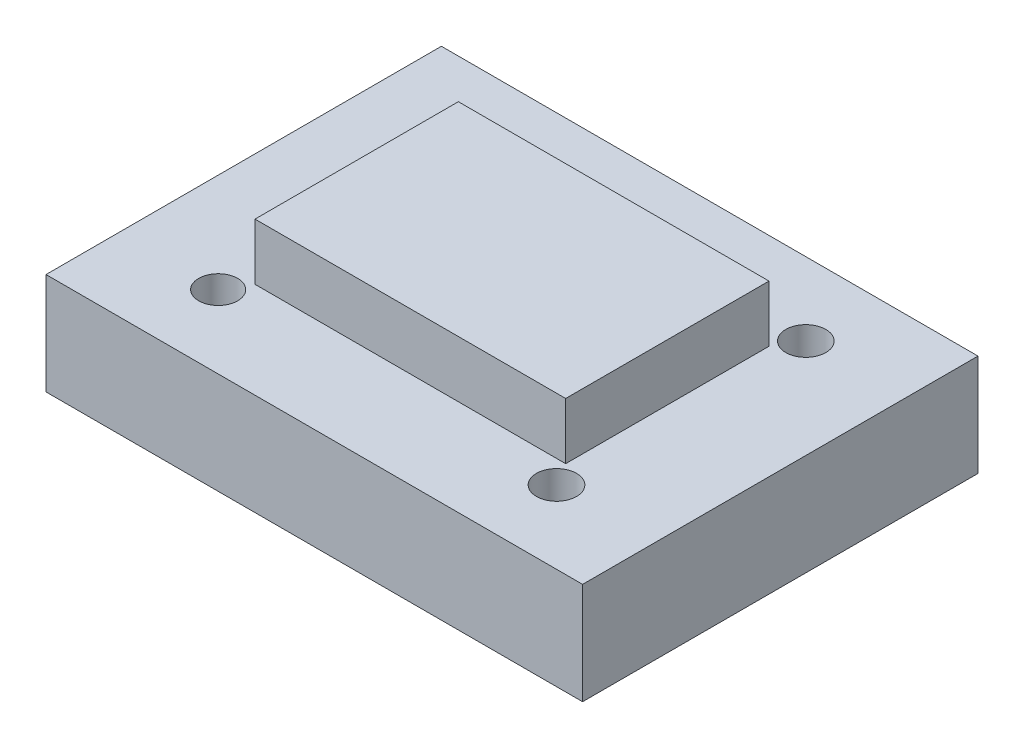
ISO-10303-21;
HEADER;
FILE_DESCRIPTION(('STEP AP214'),'2;1');
FILE_NAME('part.step','',(''),(''),'','','');
FILE_SCHEMA(('AUTOMOTIVE_DESIGN { 1 0 10303 214 1 1 1 1 }'));
ENDSEC;
DATA;
#1=APPLICATION_CONTEXT('core data for automotive mechanical design processes');
#2=APPLICATION_PROTOCOL_DEFINITION('international standard','automotive_design',2000,#1);
#3=PRODUCT_CONTEXT('',#1,'mechanical');
#4=PRODUCT('Part','Part','',(#3));
#5=PRODUCT_RELATED_PRODUCT_CATEGORY('part','',(#4));
#6=PRODUCT_DEFINITION_FORMATION('','',#4);
#7=PRODUCT_DEFINITION_CONTEXT('part definition',#1,'design');
#8=PRODUCT_DEFINITION('design','',#6,#7);
#9=PRODUCT_DEFINITION_SHAPE('','',#8);
#10=(LENGTH_UNIT() NAMED_UNIT(*) SI_UNIT(.MILLI.,.METRE.));
#11=(NAMED_UNIT(*) PLANE_ANGLE_UNIT() SI_UNIT($,.RADIAN.));
#12=(NAMED_UNIT(*) SI_UNIT($,.STERADIAN.) SOLID_ANGLE_UNIT());
#13=UNCERTAINTY_MEASURE_WITH_UNIT(LENGTH_MEASURE(1.E-05),#10,'distance_accuracy_value','');
#14=(GEOMETRIC_REPRESENTATION_CONTEXT(3) GLOBAL_UNCERTAINTY_ASSIGNED_CONTEXT((#13)) GLOBAL_UNIT_ASSIGNED_CONTEXT((#10,
#11,#12)) REPRESENTATION_CONTEXT('',''));
#15=CARTESIAN_POINT('',(0.,0.,0.));
#16=DIRECTION('',(0.,0.,1.));
#17=DIRECTION('',(1.,0.,0.));
#18=AXIS2_PLACEMENT_3D('',#15,#16,#17);
#19=CARTESIAN_POINT('',(0.,18.,0.));
#20=DIRECTION('',(0.,-1.,0.));
#21=DIRECTION('',(0.,0.,-1.));
#22=AXIS2_PLACEMENT_3D('',#19,#20,#21);
#23=PLANE('',#22);
#24=DIRECTION('',(0.,0.,-1.));
#25=VECTOR('',#24,1.);
#26=CARTESIAN_POINT('',(47.5,18.,35.));
#27=LINE('',#26,#25);
#28=CARTESIAN_POINT('',(47.5,18.,35.));
#29=VERTEX_POINT('',#28);
#30=CARTESIAN_POINT('',(47.5,18.,-35.));
#31=VERTEX_POINT('',#30);
#32=EDGE_CURVE('E160',#29,#31,#27,.T.);
#33=ORIENTED_EDGE('',*,*,#32,.T.);
#34=DIRECTION('',(-1.,0.,0.));
#35=VECTOR('',#34,1.);
#36=CARTESIAN_POINT('',(-47.5,18.,-35.));
#37=LINE('',#36,#35);
#38=CARTESIAN_POINT('',(-47.5,18.,-35.));
#39=VERTEX_POINT('',#38);
#40=EDGE_CURVE('E163',#31,#39,#37,.T.);
#41=ORIENTED_EDGE('',*,*,#40,.T.);
#42=DIRECTION('',(0.,0.,1.));
#43=VECTOR('',#42,1.);
#44=CARTESIAN_POINT('',(-47.5,18.,35.));
#45=LINE('',#44,#43);
#46=CARTESIAN_POINT('',(-47.5,18.,35.));
#47=VERTEX_POINT('',#46);
#48=EDGE_CURVE('E166',#39,#47,#45,.T.);
#49=ORIENTED_EDGE('',*,*,#48,.T.);
#50=DIRECTION('',(1.,0.,0.));
#51=VECTOR('',#50,1.);
#52=CARTESIAN_POINT('',(-47.5,18.,35.));
#53=LINE('',#52,#51);
#54=EDGE_CURVE('E168',#47,#29,#53,.T.);
#55=ORIENTED_EDGE('',*,*,#54,.T.);
#56=EDGE_LOOP('',(#33,#41,#49,#55));
#57=FACE_BOUND('',#56,.T.);
#58=CARTESIAN_POINT('',(-29.9497307001795,18.,22.0682226211849));
#59=DIRECTION('',(0.,1.,0.));
#60=DIRECTION('',(0.,0.,1.));
#61=AXIS2_PLACEMENT_3D('',#58,#59,#60);
#62=CIRCLE('',#61,3.45040522689763);
#63=CARTESIAN_POINT('',(-29.9497307001795,18.,25.5186278480825));
#64=VERTEX_POINT('',#63);
#65=EDGE_CURVE('E154',#64,#64,#62,.T.);
#66=ORIENTED_EDGE('',*,*,#65,.F.);
#67=EDGE_LOOP('',(#66));
#68=FACE_BOUND('',#67,.T.);
#69=CARTESIAN_POINT('',(29.9497307001796,18.,22.0682226211849));
#70=DIRECTION('',(0.,1.,0.));
#71=DIRECTION('',(0.,0.,1.));
#72=AXIS2_PLACEMENT_3D('',#69,#70,#71);
#73=CIRCLE('',#72,3.55026929982041);
#74=CARTESIAN_POINT('',(29.9497307001796,18.,25.6184919210054));
#75=VERTEX_POINT('',#74);
#76=EDGE_CURVE('E148',#75,#75,#73,.T.);
#77=ORIENTED_EDGE('',*,*,#76,.F.);
#78=EDGE_LOOP('',(#77));
#79=FACE_BOUND('',#78,.T.);
#80=CARTESIAN_POINT('',(-29.9497307001795,18.,-22.0682226211849));
#81=DIRECTION('',(0.,1.,0.));
#82=DIRECTION('',(0.,0.,1.));
#83=AXIS2_PLACEMENT_3D('',#80,#81,#82);
#84=CIRCLE('',#83,3.45040522689762);
#85=CARTESIAN_POINT('',(-29.9497307001795,18.,-18.6178173942873));
#86=VERTEX_POINT('',#85);
#87=EDGE_CURVE('E142',#86,#86,#84,.T.);
#88=ORIENTED_EDGE('',*,*,#87,.F.);
#89=EDGE_LOOP('',(#88));
#90=FACE_BOUND('',#89,.T.);
#91=CARTESIAN_POINT('',(29.9497307001796,18.,-22.068222621185));
#92=DIRECTION('',(0.,1.,0.));
#93=DIRECTION('',(0.,0.,1.));
#94=AXIS2_PLACEMENT_3D('',#91,#92,#93);
#95=CIRCLE('',#94,3.5502692998204);
#96=CARTESIAN_POINT('',(29.9497307001796,18.,-18.5179533213646));
#97=VERTEX_POINT('',#96);
#98=EDGE_CURVE('E136',#97,#97,#95,.T.);
#99=ORIENTED_EDGE('',*,*,#98,.F.);
#100=EDGE_LOOP('',(#99));
#101=FACE_BOUND('',#100,.T.);
#102=DIRECTION('',(0.,0.,-1.));
#103=VECTOR('',#102,1.);
#104=CARTESIAN_POINT('',(27.5,18.,0.));
#105=LINE('',#104,#103);
#106=CARTESIAN_POINT('',(27.5,18.,18.));
#107=VERTEX_POINT('',#106);
#108=CARTESIAN_POINT('',(27.5,18.,-18.));
#109=VERTEX_POINT('',#108);
#110=EDGE_CURVE('E123',#107,#109,#105,.T.);
#111=ORIENTED_EDGE('',*,*,#110,.F.);
#112=DIRECTION('',(1.,0.,0.));
#113=VECTOR('',#112,1.);
#114=CARTESIAN_POINT('',(0.,18.,18.));
#115=LINE('',#114,#113);
#116=CARTESIAN_POINT('',(-27.5,18.,18.));
#117=VERTEX_POINT('',#116);
#118=EDGE_CURVE('E124',#117,#107,#115,.T.);
#119=ORIENTED_EDGE('',*,*,#118,.F.);
#120=DIRECTION('',(0.,0.,1.));
#121=VECTOR('',#120,1.);
#122=CARTESIAN_POINT('',(-27.5,18.,0.));
#123=LINE('',#122,#121);
#124=CARTESIAN_POINT('',(-27.5,18.,-18.));
#125=VERTEX_POINT('',#124);
#126=EDGE_CURVE('E59',#125,#117,#123,.T.);
#127=ORIENTED_EDGE('',*,*,#126,.F.);
#128=DIRECTION('',(-1.,0.,0.));
#129=VECTOR('',#128,1.);
#130=CARTESIAN_POINT('',(0.,18.,-18.));
#131=LINE('',#130,#129);
#132=EDGE_CURVE('E54',#109,#125,#131,.T.);
#133=ORIENTED_EDGE('',*,*,#132,.F.);
#134=EDGE_LOOP('',(#111,#119,#127,#133));
#135=FACE_BOUND('',#134,.T.);
#136=ADVANCED_FACE('F39',(#57,#68,#79,#90,#101,#135),#23,.F.);
#137=CARTESIAN_POINT('',(0.,0.,0.));
#138=DIRECTION('',(0.,-1.,0.));
#139=DIRECTION('',(0.,0.,-1.));
#140=AXIS2_PLACEMENT_3D('',#137,#138,#139);
#141=PLANE('',#140);
#142=CARTESIAN_POINT('',(29.9497307001796,0.,-22.068222621185));
#143=DIRECTION('',(0.,1.,0.));
#144=DIRECTION('',(0.,0.,1.));
#145=AXIS2_PLACEMENT_3D('',#142,#143,#144);
#146=CIRCLE('',#145,3.5502692998204);
#147=CARTESIAN_POINT('',(29.9497307001796,0.,-18.5179533213646));
#148=VERTEX_POINT('',#147);
#149=EDGE_CURVE('E135',#148,#148,#146,.T.);
#150=ORIENTED_EDGE('',*,*,#149,.T.);
#151=EDGE_LOOP('',(#150));
#152=FACE_BOUND('',#151,.T.);
#153=CARTESIAN_POINT('',(29.9497307001796,0.,22.0682226211849));
#154=DIRECTION('',(0.,1.,0.));
#155=DIRECTION('',(0.,0.,1.));
#156=AXIS2_PLACEMENT_3D('',#153,#154,#155);
#157=CIRCLE('',#156,3.55026929982041);
#158=CARTESIAN_POINT('',(29.9497307001796,0.,25.6184919210054));
#159=VERTEX_POINT('',#158);
#160=EDGE_CURVE('E145',#159,#159,#157,.T.);
#161=ORIENTED_EDGE('',*,*,#160,.T.);
#162=EDGE_LOOP('',(#161));
#163=FACE_BOUND('',#162,.T.);
#164=DIRECTION('',(0.,0.,-1.));
#165=VECTOR('',#164,1.);
#166=CARTESIAN_POINT('',(47.5,0.,35.));
#167=LINE('',#166,#165);
#168=CARTESIAN_POINT('',(47.5,0.,35.));
#169=VERTEX_POINT('',#168);
#170=CARTESIAN_POINT('',(47.5,0.,-35.));
#171=VERTEX_POINT('',#170);
#172=EDGE_CURVE('E157',#169,#171,#167,.T.);
#173=ORIENTED_EDGE('',*,*,#172,.F.);
#174=DIRECTION('',(1.,0.,0.));
#175=VECTOR('',#174,1.);
#176=CARTESIAN_POINT('',(-47.5,0.,35.));
#177=LINE('',#176,#175);
#178=CARTESIAN_POINT('',(-47.5,0.,35.));
#179=VERTEX_POINT('',#178);
#180=EDGE_CURVE('E164',#179,#169,#177,.T.);
#181=ORIENTED_EDGE('',*,*,#180,.F.);
#182=DIRECTION('',(0.,0.,1.));
#183=VECTOR('',#182,1.);
#184=CARTESIAN_POINT('',(-47.5,0.,35.));
#185=LINE('',#184,#183);
#186=CARTESIAN_POINT('',(-47.5,0.,-35.));
#187=VERTEX_POINT('',#186);
#188=EDGE_CURVE('E175',#187,#179,#185,.T.);
#189=ORIENTED_EDGE('',*,*,#188,.F.);
#190=DIRECTION('',(-1.,0.,0.));
#191=VECTOR('',#190,1.);
#192=CARTESIAN_POINT('',(-47.5,0.,-35.));
#193=LINE('',#192,#191);
#194=EDGE_CURVE('E173',#171,#187,#193,.T.);
#195=ORIENTED_EDGE('',*,*,#194,.F.);
#196=EDGE_LOOP('',(#173,#181,#189,#195));
#197=FACE_BOUND('',#196,.T.);
#198=CARTESIAN_POINT('',(-29.9497307001795,0.,22.0682226211849));
#199=DIRECTION('',(0.,1.,0.));
#200=DIRECTION('',(0.,0.,1.));
#201=AXIS2_PLACEMENT_3D('',#198,#199,#200);
#202=CIRCLE('',#201,3.45040522689763);
#203=CARTESIAN_POINT('',(-29.9497307001795,0.,25.5186278480825));
#204=VERTEX_POINT('',#203);
#205=EDGE_CURVE('E151',#204,#204,#202,.T.);
#206=ORIENTED_EDGE('',*,*,#205,.T.);
#207=EDGE_LOOP('',(#206));
#208=FACE_BOUND('',#207,.T.);
#209=CARTESIAN_POINT('',(-29.9497307001795,0.,-22.0682226211849));
#210=DIRECTION('',(0.,1.,0.));
#211=DIRECTION('',(0.,0.,1.));
#212=AXIS2_PLACEMENT_3D('',#209,#210,#211);
#213=CIRCLE('',#212,3.45040522689762);
#214=CARTESIAN_POINT('',(-29.9497307001795,0.,-18.6178173942873));
#215=VERTEX_POINT('',#214);
#216=EDGE_CURVE('E139',#215,#215,#213,.T.);
#217=ORIENTED_EDGE('',*,*,#216,.T.);
#218=EDGE_LOOP('',(#217));
#219=FACE_BOUND('',#218,.T.);
#220=ADVANCED_FACE('F193',(#152,#163,#197,#208,#219),#141,.T.);
#221=CARTESIAN_POINT('',(47.5,18.,35.));
#222=DIRECTION('',(-1.,0.,0.));
#223=DIRECTION('',(0.,0.,1.));
#224=AXIS2_PLACEMENT_3D('',#221,#222,#223);
#225=PLANE('',#224);
#226=ORIENTED_EDGE('',*,*,#172,.T.);
#227=DIRECTION('',(0.,-1.,0.));
#228=VECTOR('',#227,1.);
#229=CARTESIAN_POINT('',(47.5,18.,-35.));
#230=LINE('',#229,#228);
#231=EDGE_CURVE('E11',#31,#171,#230,.T.);
#232=ORIENTED_EDGE('',*,*,#231,.F.);
#233=ORIENTED_EDGE('',*,*,#32,.F.);
#234=DIRECTION('',(0.,-1.,0.));
#235=VECTOR('',#234,1.);
#236=CARTESIAN_POINT('',(47.5,18.,35.));
#237=LINE('',#236,#235);
#238=EDGE_CURVE('E170',#29,#169,#237,.T.);
#239=ORIENTED_EDGE('',*,*,#238,.T.);
#240=EDGE_LOOP('',(#226,#232,#233,#239));
#241=FACE_BOUND('',#240,.T.);
#242=ADVANCED_FACE('F41',(#241),#225,.F.);
#243=CARTESIAN_POINT('',(-47.5,18.,-35.));
#244=DIRECTION('',(0.,0.,1.));
#245=DIRECTION('',(1.,0.,0.));
#246=AXIS2_PLACEMENT_3D('',#243,#244,#245);
#247=PLANE('',#246);
#248=ORIENTED_EDGE('',*,*,#194,.T.);
#249=DIRECTION('',(0.,-1.,0.));
#250=VECTOR('',#249,1.);
#251=CARTESIAN_POINT('',(-47.5,18.,-35.));
#252=LINE('',#251,#250);
#253=EDGE_CURVE('E47',#39,#187,#252,.T.);
#254=ORIENTED_EDGE('',*,*,#253,.F.);
#255=ORIENTED_EDGE('',*,*,#40,.F.);
#256=ORIENTED_EDGE('',*,*,#231,.T.);
#257=EDGE_LOOP('',(#248,#254,#255,#256));
#258=FACE_BOUND('',#257,.T.);
#259=ADVANCED_FACE('F204',(#258),#247,.F.);
#260=CARTESIAN_POINT('',(-47.5,18.,35.));
#261=DIRECTION('',(1.,0.,0.));
#262=DIRECTION('',(0.,0.,-1.));
#263=AXIS2_PLACEMENT_3D('',#260,#261,#262);
#264=PLANE('',#263);
#265=ORIENTED_EDGE('',*,*,#188,.T.);
#266=DIRECTION('',(0.,-1.,0.));
#267=VECTOR('',#266,1.);
#268=CARTESIAN_POINT('',(-47.5,18.,35.));
#269=LINE('',#268,#267);
#270=EDGE_CURVE('E180',#47,#179,#269,.T.);
#271=ORIENTED_EDGE('',*,*,#270,.F.);
#272=ORIENTED_EDGE('',*,*,#48,.F.);
#273=ORIENTED_EDGE('',*,*,#253,.T.);
#274=EDGE_LOOP('',(#265,#271,#272,#273));
#275=FACE_BOUND('',#274,.T.);
#276=ADVANCED_FACE('F187',(#275),#264,.F.);
#277=CARTESIAN_POINT('',(-47.5,18.,35.));
#278=DIRECTION('',(0.,0.,-1.));
#279=DIRECTION('',(-1.,0.,0.));
#280=AXIS2_PLACEMENT_3D('',#277,#278,#279);
#281=PLANE('',#280);
#282=ORIENTED_EDGE('',*,*,#180,.T.);
#283=ORIENTED_EDGE('',*,*,#238,.F.);
#284=ORIENTED_EDGE('',*,*,#54,.F.);
#285=ORIENTED_EDGE('',*,*,#270,.T.);
#286=EDGE_LOOP('',(#282,#283,#284,#285));
#287=FACE_BOUND('',#286,.T.);
#288=ADVANCED_FACE('F197',(#287),#281,.F.);
#289=CARTESIAN_POINT('',(-29.9497307001795,18.,22.0682226211849));
#290=DIRECTION('',(0.,-1.,0.));
#291=DIRECTION('',(0.,0.,-1.));
#292=AXIS2_PLACEMENT_3D('',#289,#290,#291);
#293=CYLINDRICAL_SURFACE('',#292,3.45040522689763);
#294=ORIENTED_EDGE('',*,*,#65,.T.);
#295=EDGE_LOOP('',(#294));
#296=FACE_BOUND('',#295,.T.);
#297=ORIENTED_EDGE('',*,*,#205,.F.);
#298=EDGE_LOOP('',(#297));
#299=FACE_BOUND('',#298,.T.);
#300=ADVANCED_FACE('F219',(#296,#299),#293,.F.);
#301=CARTESIAN_POINT('',(29.9497307001796,18.,22.0682226211849));
#302=DIRECTION('',(0.,-1.,0.));
#303=DIRECTION('',(0.,0.,-1.));
#304=AXIS2_PLACEMENT_3D('',#301,#302,#303);
#305=CYLINDRICAL_SURFACE('',#304,3.55026929982041);
#306=ORIENTED_EDGE('',*,*,#76,.T.);
#307=EDGE_LOOP('',(#306));
#308=FACE_BOUND('',#307,.T.);
#309=ORIENTED_EDGE('',*,*,#160,.F.);
#310=EDGE_LOOP('',(#309));
#311=FACE_BOUND('',#310,.T.);
#312=ADVANCED_FACE('F226',(#308,#311),#305,.F.);
#313=CARTESIAN_POINT('',(-29.9497307001795,18.,-22.0682226211849));
#314=DIRECTION('',(0.,-1.,0.));
#315=DIRECTION('',(0.,0.,-1.));
#316=AXIS2_PLACEMENT_3D('',#313,#314,#315);
#317=CYLINDRICAL_SURFACE('',#316,3.45040522689762);
#318=ORIENTED_EDGE('',*,*,#87,.T.);
#319=EDGE_LOOP('',(#318));
#320=FACE_BOUND('',#319,.T.);
#321=ORIENTED_EDGE('',*,*,#216,.F.);
#322=EDGE_LOOP('',(#321));
#323=FACE_BOUND('',#322,.T.);
#324=ADVANCED_FACE('F231',(#320,#323),#317,.F.);
#325=CARTESIAN_POINT('',(29.9497307001796,18.,-22.068222621185));
#326=DIRECTION('',(0.,-1.,0.));
#327=DIRECTION('',(0.,0.,-1.));
#328=AXIS2_PLACEMENT_3D('',#325,#326,#327);
#329=CYLINDRICAL_SURFACE('',#328,3.5502692998204);
#330=ORIENTED_EDGE('',*,*,#98,.T.);
#331=EDGE_LOOP('',(#330));
#332=FACE_BOUND('',#331,.T.);
#333=ORIENTED_EDGE('',*,*,#149,.F.);
#334=EDGE_LOOP('',(#333));
#335=FACE_BOUND('',#334,.T.);
#336=ADVANCED_FACE('F240',(#332,#335),#329,.F.);
#337=CARTESIAN_POINT('',(27.5,28.,18.));
#338=DIRECTION('',(-1.,0.,0.));
#339=DIRECTION('',(0.,0.,1.));
#340=AXIS2_PLACEMENT_3D('',#337,#338,#339);
#341=PLANE('',#340);
#342=DIRECTION('',(0.,-1.,0.));
#343=VECTOR('',#342,1.);
#344=CARTESIAN_POINT('',(27.5,28.,18.));
#345=LINE('',#344,#343);
#346=CARTESIAN_POINT('',(27.5,28.,18.));
#347=VERTEX_POINT('',#346);
#348=EDGE_CURVE('E377',#347,#107,#345,.T.);
#349=ORIENTED_EDGE('',*,*,#348,.T.);
#350=ORIENTED_EDGE('',*,*,#110,.T.);
#351=DIRECTION('',(0.,-1.,0.));
#352=VECTOR('',#351,1.);
#353=CARTESIAN_POINT('',(27.5,28.,-18.));
#354=LINE('',#353,#352);
#355=CARTESIAN_POINT('',(27.5,28.,-18.));
#356=VERTEX_POINT('',#355);
#357=EDGE_CURVE('E106',#356,#109,#354,.T.);
#358=ORIENTED_EDGE('',*,*,#357,.F.);
#359=DIRECTION('',(0.,0.,-1.));
#360=VECTOR('',#359,1.);
#361=CARTESIAN_POINT('',(27.5,28.,18.));
#362=LINE('',#361,#360);
#363=EDGE_CURVE('E112',#347,#356,#362,.T.);
#364=ORIENTED_EDGE('',*,*,#363,.F.);
#365=EDGE_LOOP('',(#349,#350,#358,#364));
#366=FACE_BOUND('',#365,.T.);
#367=ADVANCED_FACE('F122',(#366),#341,.F.);
#368=CARTESIAN_POINT('',(-27.5,28.,-18.));
#369=DIRECTION('',(0.,0.,1.));
#370=DIRECTION('',(1.,0.,0.));
#371=AXIS2_PLACEMENT_3D('',#368,#369,#370);
#372=PLANE('',#371);
#373=ORIENTED_EDGE('',*,*,#357,.T.);
#374=ORIENTED_EDGE('',*,*,#132,.T.);
#375=DIRECTION('',(0.,-1.,0.));
#376=VECTOR('',#375,1.);
#377=CARTESIAN_POINT('',(-27.5,28.,-18.));
#378=LINE('',#377,#376);
#379=CARTESIAN_POINT('',(-27.5,28.,-18.));
#380=VERTEX_POINT('',#379);
#381=EDGE_CURVE('E108',#380,#125,#378,.T.);
#382=ORIENTED_EDGE('',*,*,#381,.F.);
#383=DIRECTION('',(-1.,0.,0.));
#384=VECTOR('',#383,1.);
#385=CARTESIAN_POINT('',(-27.5,28.,-18.));
#386=LINE('',#385,#384);
#387=EDGE_CURVE('E102',#356,#380,#386,.T.);
#388=ORIENTED_EDGE('',*,*,#387,.F.);
#389=EDGE_LOOP('',(#373,#374,#382,#388));
#390=FACE_BOUND('',#389,.T.);
#391=ADVANCED_FACE('F104',(#390),#372,.F.);
#392=CARTESIAN_POINT('',(-27.5,28.,18.));
#393=DIRECTION('',(1.,0.,0.));
#394=DIRECTION('',(0.,0.,-1.));
#395=AXIS2_PLACEMENT_3D('',#392,#393,#394);
#396=PLANE('',#395);
#397=ORIENTED_EDGE('',*,*,#381,.T.);
#398=ORIENTED_EDGE('',*,*,#126,.T.);
#399=DIRECTION('',(0.,-1.,0.));
#400=VECTOR('',#399,1.);
#401=CARTESIAN_POINT('',(-27.5,28.,18.));
#402=LINE('',#401,#400);
#403=CARTESIAN_POINT('',(-27.5,28.,18.));
#404=VERTEX_POINT('',#403);
#405=EDGE_CURVE('E128',#404,#117,#402,.T.);
#406=ORIENTED_EDGE('',*,*,#405,.F.);
#407=DIRECTION('',(0.,0.,1.));
#408=VECTOR('',#407,1.);
#409=CARTESIAN_POINT('',(-27.5,28.,18.));
#410=LINE('',#409,#408);
#411=EDGE_CURVE('E111',#380,#404,#410,.T.);
#412=ORIENTED_EDGE('',*,*,#411,.F.);
#413=EDGE_LOOP('',(#397,#398,#406,#412));
#414=FACE_BOUND('',#413,.T.);
#415=ADVANCED_FACE('F253',(#414),#396,.F.);
#416=CARTESIAN_POINT('',(-27.5,28.,18.));
#417=DIRECTION('',(0.,0.,-1.));
#418=DIRECTION('',(-1.,0.,0.));
#419=AXIS2_PLACEMENT_3D('',#416,#417,#418);
#420=PLANE('',#419);
#421=ORIENTED_EDGE('',*,*,#405,.T.);
#422=ORIENTED_EDGE('',*,*,#118,.T.);
#423=ORIENTED_EDGE('',*,*,#348,.F.);
#424=DIRECTION('',(1.,0.,0.));
#425=VECTOR('',#424,1.);
#426=CARTESIAN_POINT('',(-27.5,28.,18.));
#427=LINE('',#426,#425);
#428=EDGE_CURVE('E117',#404,#347,#427,.T.);
#429=ORIENTED_EDGE('',*,*,#428,.F.);
#430=EDGE_LOOP('',(#421,#422,#423,#429));
#431=FACE_BOUND('',#430,.T.);
#432=ADVANCED_FACE('F256',(#431),#420,.F.);
#433=CARTESIAN_POINT('',(0.,28.,0.));
#434=DIRECTION('',(0.,-1.,0.));
#435=DIRECTION('',(0.,0.,-1.));
#436=AXIS2_PLACEMENT_3D('',#433,#434,#435);
#437=PLANE('',#436);
#438=ORIENTED_EDGE('',*,*,#363,.T.);
#439=ORIENTED_EDGE('',*,*,#387,.T.);
#440=ORIENTED_EDGE('',*,*,#411,.T.);
#441=ORIENTED_EDGE('',*,*,#428,.T.);
#442=EDGE_LOOP('',(#438,#439,#440,#441));
#443=FACE_BOUND('',#442,.T.);
#444=ADVANCED_FACE('F115',(#443),#437,.F.);
#445=CLOSED_SHELL('',(#136,#220,#242,#259,#276,#288,#300,#312,#324,#336,#367,#391,#415,#432,#444));
#446=MANIFOLD_SOLID_BREP('B2',#445);
#447=ADVANCED_BREP_SHAPE_REPRESENTATION('',(#18,#446),#14);
#448=SHAPE_DEFINITION_REPRESENTATION(#9,#447);
ENDSEC;
END-ISO-10303-21;
